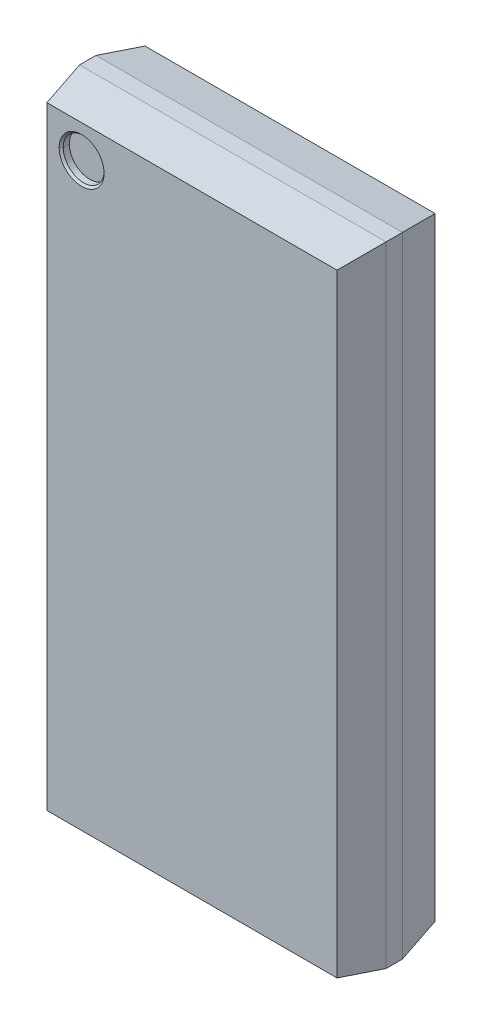
ISO-10303-21;
HEADER;
FILE_DESCRIPTION(('STEP AP214'),'2;1');
FILE_NAME('part.step','',(''),(''),'','','');
FILE_SCHEMA(('AUTOMOTIVE_DESIGN { 1 0 10303 214 1 1 1 1 }'));
ENDSEC;
DATA;
#1=APPLICATION_CONTEXT('core data for automotive mechanical design processes');
#2=APPLICATION_PROTOCOL_DEFINITION('international standard','automotive_design',2000,#1);
#3=PRODUCT_CONTEXT('',#1,'mechanical');
#4=PRODUCT('Part','Part','',(#3));
#5=PRODUCT_RELATED_PRODUCT_CATEGORY('part','',(#4));
#6=PRODUCT_DEFINITION_FORMATION('','',#4);
#7=PRODUCT_DEFINITION_CONTEXT('part definition',#1,'design');
#8=PRODUCT_DEFINITION('design','',#6,#7);
#9=PRODUCT_DEFINITION_SHAPE('','',#8);
#10=(LENGTH_UNIT() NAMED_UNIT(*) SI_UNIT(.MILLI.,.METRE.));
#11=(NAMED_UNIT(*) PLANE_ANGLE_UNIT() SI_UNIT($,.RADIAN.));
#12=(NAMED_UNIT(*) SI_UNIT($,.STERADIAN.) SOLID_ANGLE_UNIT());
#13=UNCERTAINTY_MEASURE_WITH_UNIT(LENGTH_MEASURE(1.E-05),#10,'distance_accuracy_value','');
#14=(GEOMETRIC_REPRESENTATION_CONTEXT(3) GLOBAL_UNCERTAINTY_ASSIGNED_CONTEXT((#13)) GLOBAL_UNIT_ASSIGNED_CONTEXT((#10,
#11,#12)) REPRESENTATION_CONTEXT('',''));
#15=CARTESIAN_POINT('',(0.,0.,0.));
#16=DIRECTION('',(0.,0.,1.));
#17=DIRECTION('',(1.,0.,0.));
#18=AXIS2_PLACEMENT_3D('',#15,#16,#17);
#19=CARTESIAN_POINT('',(-2.700000005961,6.564999993444,2.4));
#20=DIRECTION('',(0.,0.,1.));
#21=DIRECTION('',(1.,0.,0.));
#22=AXIS2_PLACEMENT_3D('',#19,#20,#21);
#23=PLANE('',#22);
#24=CARTESIAN_POINT('',(-2.700000005961,6.564999993444,2.4));
#25=DIRECTION('',(0.,0.,1.));
#26=DIRECTION('',(1.,0.,0.));
#27=AXIS2_PLACEMENT_3D('',#24,#25,#26);
#28=CIRCLE('',#27,0.5);
#29=CARTESIAN_POINT('',(-2.20000000596,6.564999993444,2.4));
#30=VERTEX_POINT('',#29);
#31=CARTESIAN_POINT('',(-3.200000005961,6.564999993444,2.4));
#32=VERTEX_POINT('',#31);
#33=EDGE_CURVE('E11',#30,#32,#28,.T.);
#34=ORIENTED_EDGE('',*,*,#33,.T.);
#35=CARTESIAN_POINT('',(-2.700000005961,6.564999993444,2.4));
#36=DIRECTION('',(0.,0.,1.));
#37=DIRECTION('',(1.,0.,0.));
#38=AXIS2_PLACEMENT_3D('',#35,#36,#37);
#39=CIRCLE('',#38,0.5);
#40=EDGE_CURVE('E221',#32,#30,#39,.T.);
#41=ORIENTED_EDGE('',*,*,#40,.T.);
#42=EDGE_LOOP('',(#34,#41));
#43=FACE_BOUND('',#42,.T.);
#44=ADVANCED_FACE('F16',(#43),#23,.T.);
#45=CARTESIAN_POINT('',(-2.700000005961,6.564999993444,2.4));
#46=DIRECTION('',(0.,0.,1.));
#47=DIRECTION('',(1.,0.,0.));
#48=AXIS2_PLACEMENT_3D('',#45,#46,#47);
#49=CYLINDRICAL_SURFACE('',#48,0.5);
#50=DIRECTION('',(0.,0.,1.));
#51=VECTOR('',#50,1.);
#52=CARTESIAN_POINT('',(-3.200000005961,6.564999993444,2.4));
#53=LINE('',#52,#51);
#54=CARTESIAN_POINT('',(-3.200000005906,6.564999993444,2.550000095312));
#55=VERTEX_POINT('',#54);
#56=EDGE_CURVE('E232',#32,#55,#53,.T.);
#57=ORIENTED_EDGE('',*,*,#56,.F.);
#58=ORIENTED_EDGE('',*,*,#33,.F.);
#59=DIRECTION('',(0.,0.,1.));
#60=VECTOR('',#59,1.);
#61=CARTESIAN_POINT('',(-2.20000000596,6.564999993444,2.4));
#62=LINE('',#61,#60);
#63=CARTESIAN_POINT('',(-2.200000006015,6.564999993444,2.550000095312));
#64=VERTEX_POINT('',#63);
#65=EDGE_CURVE('E235',#30,#64,#62,.T.);
#66=ORIENTED_EDGE('',*,*,#65,.T.);
#67=CARTESIAN_POINT('',(-2.700000005961,6.564999993444,2.550000095312));
#68=DIRECTION('',(0.,0.,1.));
#69=DIRECTION('',(0.,-1.,0.));
#70=AXIS2_PLACEMENT_3D('',#67,#68,#69);
#71=CIRCLE('',#70,0.499999999945);
#72=EDGE_CURVE('E27',#64,#55,#71,.T.);
#73=ORIENTED_EDGE('',*,*,#72,.T.);
#74=EDGE_LOOP('',(#57,#58,#66,#73));
#75=FACE_BOUND('',#74,.T.);
#76=ADVANCED_FACE('F231',(#75),#49,.F.);
#77=CARTESIAN_POINT('',(-2.700000005961,6.564999993444,2.600000095356));
#78=DIRECTION('',(0.,0.,1.));
#79=DIRECTION('',(1.,0.,0.));
#80=AXIS2_PLACEMENT_3D('',#77,#78,#79);
#81=CONICAL_SURFACE('',#80,0.550000000047,0.785398163397);
#82=DIRECTION('',(-0.707106781186548,0.,0.707106781186548));
#83=VECTOR('',#82,1.);
#84=CARTESIAN_POINT('',(-3.250000006007,6.564999993444,2.600000095356));
#85=LINE('',#84,#83);
#86=CARTESIAN_POINT('',(-3.250000006007,6.564999993444,2.600000095356));
#87=VERTEX_POINT('',#86);
#88=EDGE_CURVE('E213',#55,#87,#85,.T.);
#89=ORIENTED_EDGE('',*,*,#88,.F.);
#90=ORIENTED_EDGE('',*,*,#72,.F.);
#91=DIRECTION('',(0.707106781186548,0.,0.707106781186548));
#92=VECTOR('',#91,1.);
#93=CARTESIAN_POINT('',(-2.150000005914,6.564999993444,2.600000095356));
#94=LINE('',#93,#92);
#95=CARTESIAN_POINT('',(-2.150000005914,6.564999993444,2.600000095356));
#96=VERTEX_POINT('',#95);
#97=EDGE_CURVE('E217',#64,#96,#94,.T.);
#98=ORIENTED_EDGE('',*,*,#97,.T.);
#99=CARTESIAN_POINT('',(-2.700000005961,6.564999993444,2.600000095356));
#100=DIRECTION('',(0.,0.,-1.));
#101=DIRECTION('',(1.,0.,0.));
#102=AXIS2_PLACEMENT_3D('',#99,#100,#101);
#103=CIRCLE('',#102,0.550000000047);
#104=EDGE_CURVE('E126',#87,#96,#103,.T.);
#105=ORIENTED_EDGE('',*,*,#104,.F.);
#106=EDGE_LOOP('',(#89,#90,#98,#105));
#107=FACE_BOUND('',#106,.T.);
#108=ADVANCED_FACE('F246',(#107),#81,.F.);
#109=CARTESIAN_POINT('',(-3.750000005961,7.564999993444,2.600000095367));
#110=DIRECTION('',(0.,0.,1.));
#111=DIRECTION('',(1.,0.,0.));
#112=AXIS2_PLACEMENT_3D('',#109,#110,#111);
#113=PLANE('',#112);
#114=DIRECTION('',(0.,-1.,0.));
#115=VECTOR('',#114,1.);
#116=CARTESIAN_POINT('',(-3.550000005961,7.564999993444,2.600000095367));
#117=LINE('',#116,#115);
#118=CARTESIAN_POINT('',(-3.550000005961,7.364999993444,2.600000095367));
#119=VERTEX_POINT('',#118);
#120=CARTESIAN_POINT('',(-3.550000005961,-7.634999625087,2.600000095367));
#121=VERTEX_POINT('',#120);
#122=EDGE_CURVE('E130',#119,#121,#117,.T.);
#123=ORIENTED_EDGE('',*,*,#122,.T.);
#124=DIRECTION('',(-1.,0.,0.));
#125=VECTOR('',#124,1.);
#126=CARTESIAN_POINT('',(-3.550000005961,-7.634999625087,2.600000095367));
#127=LINE('',#126,#125);
#128=CARTESIAN_POINT('',(3.54999999404,-7.634999625087,2.600000095367));
#129=VERTEX_POINT('',#128);
#130=EDGE_CURVE('E41',#129,#121,#127,.T.);
#131=ORIENTED_EDGE('',*,*,#130,.F.);
#132=DIRECTION('',(0.,-1.,0.));
#133=VECTOR('',#132,1.);
#134=CARTESIAN_POINT('',(3.54999999404,7.564999993444,2.600000095367));
#135=LINE('',#134,#133);
#136=CARTESIAN_POINT('',(3.54999999404,7.364999993444,2.600000095367));
#137=VERTEX_POINT('',#136);
#138=EDGE_CURVE('E127',#137,#129,#135,.T.);
#139=ORIENTED_EDGE('',*,*,#138,.F.);
#140=DIRECTION('',(-1.,0.,0.));
#141=VECTOR('',#140,1.);
#142=CARTESIAN_POINT('',(-3.550000005961,7.364999993444,2.600000095367));
#143=LINE('',#142,#141);
#144=EDGE_CURVE('E134',#137,#119,#143,.T.);
#145=ORIENTED_EDGE('',*,*,#144,.T.);
#146=EDGE_LOOP('',(#123,#131,#139,#145));
#147=FACE_BOUND('',#146,.T.);
#148=CARTESIAN_POINT('',(-2.700000005961,6.564999993444,2.600000095356));
#149=DIRECTION('',(0.,0.,-1.));
#150=DIRECTION('',(1.,0.,0.));
#151=AXIS2_PLACEMENT_3D('',#148,#149,#150);
#152=CIRCLE('',#151,0.550000000047);
#153=EDGE_CURVE('E222',#96,#87,#152,.T.);
#154=ORIENTED_EDGE('',*,*,#153,.T.);
#155=ORIENTED_EDGE('',*,*,#104,.T.);
#156=EDGE_LOOP('',(#154,#155));
#157=FACE_BOUND('',#156,.T.);
#158=ADVANCED_FACE('F131',(#147,#157),#113,.T.);
#159=CARTESIAN_POINT('',(-3.550000005961,-7.734999625086,2.100000095367));
#160=DIRECTION('',(0.,-0.980580675690959,0.196116135137992));
#161=DIRECTION('',(-1.,0.,0.));
#162=AXIS2_PLACEMENT_3D('',#159,#160,#161);
#163=PLANE('',#162);
#164=DIRECTION('',(-1.,0.,0.));
#165=VECTOR('',#164,1.);
#166=CARTESIAN_POINT('',(-3.750000005961,-7.834999625086,1.600000095367));
#167=LINE('',#166,#165);
#168=CARTESIAN_POINT('',(3.749999994039,-7.834999625086,1.600000095367));
#169=VERTEX_POINT('',#168);
#170=CARTESIAN_POINT('',(-3.75000000596,-7.834999625086,1.600000095367));
#171=VERTEX_POINT('',#170);
#172=EDGE_CURVE('E146',#169,#171,#167,.T.);
#173=ORIENTED_EDGE('',*,*,#172,.F.);
#174=DIRECTION('',(0.192450089730061,-0.192450089730061,-0.962250448649302));
#175=VECTOR('',#174,1.);
#176=CARTESIAN_POINT('',(3.54999999404,-7.634999625087,2.600000095367));
#177=LINE('',#176,#175);
#178=EDGE_CURVE('E124',#129,#169,#177,.T.);
#179=ORIENTED_EDGE('',*,*,#178,.F.);
#180=ORIENTED_EDGE('',*,*,#130,.T.);
#181=DIRECTION('',(-0.192450089730061,-0.192450089730061,-0.962250448649302));
#182=VECTOR('',#181,1.);
#183=CARTESIAN_POINT('',(-3.550000005961,-7.634999625087,2.600000095367));
#184=LINE('',#183,#182);
#185=EDGE_CURVE('E122',#121,#171,#184,.T.);
#186=ORIENTED_EDGE('',*,*,#185,.T.);
#187=EDGE_LOOP('',(#173,#179,#180,#186));
#188=FACE_BOUND('',#187,.T.);
#189=ADVANCED_FACE('F120',(#188),#163,.T.);
#190=CARTESIAN_POINT('',(3.64999999404,7.564999993444,2.100000095367));
#191=DIRECTION('',(0.980580675690959,0.,0.196116135137992));
#192=DIRECTION('',(0.,-1.,0.));
#193=AXIS2_PLACEMENT_3D('',#190,#191,#192);
#194=PLANE('',#193);
#195=ORIENTED_EDGE('',*,*,#178,.T.);
#196=DIRECTION('',(0.,-1.,0.));
#197=VECTOR('',#196,1.);
#198=CARTESIAN_POINT('',(3.74999999404,7.564999993444,1.600000095367));
#199=LINE('',#198,#197);
#200=CARTESIAN_POINT('',(3.749999994039,7.564999993443,1.600000095367));
#201=VERTEX_POINT('',#200);
#202=EDGE_CURVE('E152',#201,#169,#199,.T.);
#203=ORIENTED_EDGE('',*,*,#202,.F.);
#204=DIRECTION('',(-0.192450089730061,-0.192450089730061,0.962250448649302));
#205=VECTOR('',#204,1.);
#206=CARTESIAN_POINT('',(3.74999999404,7.564999993443,1.600000095367));
#207=LINE('',#206,#205);
#208=EDGE_CURVE('E179',#201,#137,#207,.T.);
#209=ORIENTED_EDGE('',*,*,#208,.T.);
#210=ORIENTED_EDGE('',*,*,#138,.T.);
#211=EDGE_LOOP('',(#195,#203,#209,#210));
#212=FACE_BOUND('',#211,.T.);
#213=ADVANCED_FACE('F18',(#212),#194,.T.);
#214=CARTESIAN_POINT('',(-3.550000005961,7.464999993443,2.100000095367));
#215=DIRECTION('',(0.,-0.980580675690959,-0.196116135137992));
#216=DIRECTION('',(0.,0.196116135137992,-0.980580675690959));
#217=AXIS2_PLACEMENT_3D('',#214,#215,#216);
#218=PLANE('',#217);
#219=DIRECTION('',(-1.,0.,0.));
#220=VECTOR('',#219,1.);
#221=CARTESIAN_POINT('',(-3.750000005961,7.564999993444,1.600000095367));
#222=LINE('',#221,#220);
#223=CARTESIAN_POINT('',(-3.75000000596,7.564999993443,1.600000095367));
#224=VERTEX_POINT('',#223);
#225=EDGE_CURVE('E202',#201,#224,#222,.T.);
#226=ORIENTED_EDGE('',*,*,#225,.T.);
#227=DIRECTION('',(0.192450089730061,-0.192450089730061,0.962250448649302));
#228=VECTOR('',#227,1.);
#229=CARTESIAN_POINT('',(-3.75000000596,7.564999993443,1.600000095367));
#230=LINE('',#229,#228);
#231=EDGE_CURVE('E138',#224,#119,#230,.T.);
#232=ORIENTED_EDGE('',*,*,#231,.T.);
#233=ORIENTED_EDGE('',*,*,#144,.F.);
#234=ORIENTED_EDGE('',*,*,#208,.F.);
#235=EDGE_LOOP('',(#226,#232,#233,#234));
#236=FACE_BOUND('',#235,.T.);
#237=ADVANCED_FACE('F422',(#236),#218,.F.);
#238=CARTESIAN_POINT('',(-3.650000005961,7.564999993444,2.100000095367));
#239=DIRECTION('',(0.980580675690959,0.,-0.196116135137992));
#240=DIRECTION('',(0.,-1.,0.));
#241=AXIS2_PLACEMENT_3D('',#238,#239,#240);
#242=PLANE('',#241);
#243=DIRECTION('',(0.,-1.,0.));
#244=VECTOR('',#243,1.);
#245=CARTESIAN_POINT('',(-3.750000005961,7.564999993444,1.600000095367));
#246=LINE('',#245,#244);
#247=EDGE_CURVE('E143',#224,#171,#246,.T.);
#248=ORIENTED_EDGE('',*,*,#247,.T.);
#249=ORIENTED_EDGE('',*,*,#185,.F.);
#250=ORIENTED_EDGE('',*,*,#122,.F.);
#251=ORIENTED_EDGE('',*,*,#231,.F.);
#252=EDGE_LOOP('',(#248,#249,#250,#251));
#253=FACE_BOUND('',#252,.T.);
#254=ADVANCED_FACE('F141',(#253),#242,.F.);
#255=CARTESIAN_POINT('',(-3.750000005961,-7.834999625086,0.2));
#256=DIRECTION('',(0.,-1.,0.));
#257=DIRECTION('',(0.,0.,-1.));
#258=AXIS2_PLACEMENT_3D('',#255,#256,#257);
#259=PLANE('',#258);
#260=DIRECTION('',(1.,0.,0.));
#261=VECTOR('',#260,1.);
#262=CARTESIAN_POINT('',(-3.550000005961,-7.834999625086,1.2));
#263=LINE('',#262,#261);
#264=CARTESIAN_POINT('',(-3.75000000596,-7.834999625086,1.2));
#265=VERTEX_POINT('',#264);
#266=CARTESIAN_POINT('',(3.749999994039,-7.834999625086,1.2));
#267=VERTEX_POINT('',#266);
#268=EDGE_CURVE('E216',#265,#267,#263,.T.);
#269=ORIENTED_EDGE('',*,*,#268,.T.);
#270=DIRECTION('',(0.,0.,-1.));
#271=VECTOR('',#270,1.);
#272=CARTESIAN_POINT('',(3.74999999404,-7.834999625086,0.2));
#273=LINE('',#272,#271);
#274=EDGE_CURVE('E199',#169,#267,#273,.T.);
#275=ORIENTED_EDGE('',*,*,#274,.F.);
#276=ORIENTED_EDGE('',*,*,#172,.T.);
#277=DIRECTION('',(0.,0.,-1.));
#278=VECTOR('',#277,1.);
#279=CARTESIAN_POINT('',(-3.75000000596,-7.834999625086,0.2));
#280=LINE('',#279,#278);
#281=EDGE_CURVE('E167',#171,#265,#280,.T.);
#282=ORIENTED_EDGE('',*,*,#281,.T.);
#283=EDGE_LOOP('',(#269,#275,#276,#282));
#284=FACE_BOUND('',#283,.T.);
#285=ADVANCED_FACE('F421',(#284),#259,.T.);
#286=CARTESIAN_POINT('',(3.74999999404,7.564999993444,0.2));
#287=DIRECTION('',(1.,0.,0.));
#288=DIRECTION('',(0.,1.,0.));
#289=AXIS2_PLACEMENT_3D('',#286,#287,#288);
#290=PLANE('',#289);
#291=ORIENTED_EDGE('',*,*,#274,.T.);
#292=DIRECTION('',(0.,1.,0.));
#293=VECTOR('',#292,1.);
#294=CARTESIAN_POINT('',(3.749999994039,7.564999993444,1.2));
#295=LINE('',#294,#293);
#296=CARTESIAN_POINT('',(3.749999994039,7.564999993443,1.2));
#297=VERTEX_POINT('',#296);
#298=EDGE_CURVE('E162',#267,#297,#295,.T.);
#299=ORIENTED_EDGE('',*,*,#298,.T.);
#300=DIRECTION('',(0.,0.,1.));
#301=VECTOR('',#300,1.);
#302=CARTESIAN_POINT('',(3.749999994039,7.564999993444,0.2));
#303=LINE('',#302,#301);
#304=EDGE_CURVE('E20',#297,#201,#303,.T.);
#305=ORIENTED_EDGE('',*,*,#304,.T.);
#306=ORIENTED_EDGE('',*,*,#202,.T.);
#307=EDGE_LOOP('',(#291,#299,#305,#306));
#308=FACE_BOUND('',#307,.T.);
#309=ADVANCED_FACE('F478',(#308),#290,.T.);
#310=CARTESIAN_POINT('',(-3.750000005961,7.564999993444,0.2));
#311=DIRECTION('',(0.,-1.,0.));
#312=DIRECTION('',(0.,0.,-1.));
#313=AXIS2_PLACEMENT_3D('',#310,#311,#312);
#314=PLANE('',#313);
#315=ORIENTED_EDGE('',*,*,#304,.F.);
#316=DIRECTION('',(1.,0.,0.));
#317=VECTOR('',#316,1.);
#318=CARTESIAN_POINT('',(-3.550000005961,7.564999993443,1.2));
#319=LINE('',#318,#317);
#320=CARTESIAN_POINT('',(-3.75000000596,7.564999993443,1.2));
#321=VERTEX_POINT('',#320);
#322=EDGE_CURVE('E183',#321,#297,#319,.T.);
#323=ORIENTED_EDGE('',*,*,#322,.F.);
#324=DIRECTION('',(0.,0.,1.));
#325=VECTOR('',#324,1.);
#326=CARTESIAN_POINT('',(-3.750000005961,7.564999993443,0.2));
#327=LINE('',#326,#325);
#328=EDGE_CURVE('E166',#321,#224,#327,.T.);
#329=ORIENTED_EDGE('',*,*,#328,.T.);
#330=ORIENTED_EDGE('',*,*,#225,.F.);
#331=EDGE_LOOP('',(#315,#323,#329,#330));
#332=FACE_BOUND('',#331,.T.);
#333=ADVANCED_FACE('F467',(#332),#314,.F.);
#334=CARTESIAN_POINT('',(-3.750000005961,7.564999993444,0.2));
#335=DIRECTION('',(1.,0.,0.));
#336=DIRECTION('',(0.,1.,0.));
#337=AXIS2_PLACEMENT_3D('',#334,#335,#336);
#338=PLANE('',#337);
#339=DIRECTION('',(0.,1.,0.));
#340=VECTOR('',#339,1.);
#341=CARTESIAN_POINT('',(-3.75000000596,7.564999993444,1.2));
#342=LINE('',#341,#340);
#343=EDGE_CURVE('E203',#265,#321,#342,.T.);
#344=ORIENTED_EDGE('',*,*,#343,.F.);
#345=ORIENTED_EDGE('',*,*,#281,.F.);
#346=ORIENTED_EDGE('',*,*,#247,.F.);
#347=ORIENTED_EDGE('',*,*,#328,.F.);
#348=EDGE_LOOP('',(#344,#345,#346,#347));
#349=FACE_BOUND('',#348,.T.);
#350=ADVANCED_FACE('F389',(#349),#338,.F.);
#351=CARTESIAN_POINT('',(-3.550000005961,-7.734999625086,0.7));
#352=DIRECTION('',(0.,0.980580675690959,0.196116135137992));
#353=DIRECTION('',(1.,0.,0.));
#354=AXIS2_PLACEMENT_3D('',#351,#352,#353);
#355=PLANE('',#354);
#356=DIRECTION('',(0.192450089730061,-0.192450089730061,0.962250448649302));
#357=VECTOR('',#356,1.);
#358=CARTESIAN_POINT('',(3.54999999404,-7.634999625087,0.2));
#359=LINE('',#358,#357);
#360=CARTESIAN_POINT('',(3.54999999404,-7.634999625087,0.2));
#361=VERTEX_POINT('',#360);
#362=EDGE_CURVE('E158',#361,#267,#359,.T.);
#363=ORIENTED_EDGE('',*,*,#362,.T.);
#364=ORIENTED_EDGE('',*,*,#268,.F.);
#365=DIRECTION('',(-0.192450089730061,-0.192450089730061,0.962250448649302));
#366=VECTOR('',#365,1.);
#367=CARTESIAN_POINT('',(-3.550000005961,-7.634999625087,0.2));
#368=LINE('',#367,#366);
#369=CARTESIAN_POINT('',(-3.550000005961,-7.634999625087,0.2));
#370=VERTEX_POINT('',#369);
#371=EDGE_CURVE('E156',#370,#265,#368,.T.);
#372=ORIENTED_EDGE('',*,*,#371,.F.);
#373=DIRECTION('',(1.,0.,0.));
#374=VECTOR('',#373,1.);
#375=CARTESIAN_POINT('',(-3.750000005961,-7.634999625087,0.2));
#376=LINE('',#375,#374);
#377=EDGE_CURVE('E172',#370,#361,#376,.T.);
#378=ORIENTED_EDGE('',*,*,#377,.T.);
#379=EDGE_LOOP('',(#363,#364,#372,#378));
#380=FACE_BOUND('',#379,.T.);
#381=ADVANCED_FACE('F383',(#380),#355,.F.);
#382=CARTESIAN_POINT('',(3.64999999404,7.564999993444,0.7));
#383=DIRECTION('',(-0.980580675690959,0.,0.196116135137992));
#384=DIRECTION('',(0.,1.,0.));
#385=AXIS2_PLACEMENT_3D('',#382,#383,#384);
#386=PLANE('',#385);
#387=ORIENTED_EDGE('',*,*,#362,.F.);
#388=DIRECTION('',(0.,1.,0.));
#389=VECTOR('',#388,1.);
#390=CARTESIAN_POINT('',(3.54999999404,7.564999993444,0.2));
#391=LINE('',#390,#389);
#392=CARTESIAN_POINT('',(3.54999999404,7.364999993444,0.2));
#393=VERTEX_POINT('',#392);
#394=EDGE_CURVE('E168',#361,#393,#391,.T.);
#395=ORIENTED_EDGE('',*,*,#394,.T.);
#396=DIRECTION('',(-0.192450089730061,-0.192450089730061,-0.962250448649302));
#397=VECTOR('',#396,1.);
#398=CARTESIAN_POINT('',(3.74999999404,7.564999993443,1.2));
#399=LINE('',#398,#397);
#400=EDGE_CURVE('E163',#297,#393,#399,.T.);
#401=ORIENTED_EDGE('',*,*,#400,.F.);
#402=ORIENTED_EDGE('',*,*,#298,.F.);
#403=EDGE_LOOP('',(#387,#395,#401,#402));
#404=FACE_BOUND('',#403,.T.);
#405=ADVANCED_FACE('F388',(#404),#386,.F.);
#406=CARTESIAN_POINT('',(-3.550000005961,7.464999993443,0.7));
#407=DIRECTION('',(0.,0.980580675690959,-0.196116135137992));
#408=DIRECTION('',(-1.,0.,0.));
#409=AXIS2_PLACEMENT_3D('',#406,#407,#408);
#410=PLANE('',#409);
#411=DIRECTION('',(0.192450089730061,-0.192450089730061,-0.962250448649302));
#412=VECTOR('',#411,1.);
#413=CARTESIAN_POINT('',(-3.75000000596,7.564999993443,1.2));
#414=LINE('',#413,#412);
#415=CARTESIAN_POINT('',(-3.550000005961,7.364999993444,0.2));
#416=VERTEX_POINT('',#415);
#417=EDGE_CURVE('E187',#321,#416,#414,.T.);
#418=ORIENTED_EDGE('',*,*,#417,.F.);
#419=ORIENTED_EDGE('',*,*,#322,.T.);
#420=ORIENTED_EDGE('',*,*,#400,.T.);
#421=DIRECTION('',(-1.,0.,0.));
#422=VECTOR('',#421,1.);
#423=CARTESIAN_POINT('',(-3.750000005961,7.364999993444,0.2));
#424=LINE('',#423,#422);
#425=EDGE_CURVE('E173',#393,#416,#424,.T.);
#426=ORIENTED_EDGE('',*,*,#425,.T.);
#427=EDGE_LOOP('',(#418,#419,#420,#426));
#428=FACE_BOUND('',#427,.T.);
#429=ADVANCED_FACE('F453',(#428),#410,.T.);
#430=CARTESIAN_POINT('',(-3.650000005961,7.564999993444,0.7));
#431=DIRECTION('',(-0.980580675690959,0.,-0.196116135137992));
#432=DIRECTION('',(-0.196116135137992,0.,0.980580675690959));
#433=AXIS2_PLACEMENT_3D('',#430,#431,#432);
#434=PLANE('',#433);
#435=ORIENTED_EDGE('',*,*,#371,.T.);
#436=ORIENTED_EDGE('',*,*,#343,.T.);
#437=ORIENTED_EDGE('',*,*,#417,.T.);
#438=DIRECTION('',(0.,-1.,0.));
#439=VECTOR('',#438,1.);
#440=CARTESIAN_POINT('',(-3.550000005961,7.564999993444,0.2));
#441=LINE('',#440,#439);
#442=EDGE_CURVE('E174',#416,#370,#441,.T.);
#443=ORIENTED_EDGE('',*,*,#442,.T.);
#444=EDGE_LOOP('',(#435,#436,#437,#443));
#445=FACE_BOUND('',#444,.T.);
#446=ADVANCED_FACE('F445',(#445),#434,.T.);
#447=CARTESIAN_POINT('',(-3.750000005961,7.564999993444,0.2));
#448=DIRECTION('',(0.,0.,1.));
#449=DIRECTION('',(1.,0.,0.));
#450=AXIS2_PLACEMENT_3D('',#447,#448,#449);
#451=PLANE('',#450);
#452=ORIENTED_EDGE('',*,*,#425,.F.);
#453=ORIENTED_EDGE('',*,*,#394,.F.);
#454=ORIENTED_EDGE('',*,*,#377,.F.);
#455=ORIENTED_EDGE('',*,*,#442,.F.);
#456=EDGE_LOOP('',(#452,#453,#454,#455));
#457=FACE_BOUND('',#456,.T.);
#458=ADVANCED_FACE('F434',(#457),#451,.F.);
#459=CARTESIAN_POINT('',(-2.700000005961,6.564999993444,2.4));
#460=DIRECTION('',(0.,0.,1.));
#461=DIRECTION('',(1.,0.,0.));
#462=AXIS2_PLACEMENT_3D('',#459,#460,#461);
#463=CYLINDRICAL_SURFACE('',#462,0.5);
#464=ORIENTED_EDGE('',*,*,#40,.F.);
#465=ORIENTED_EDGE('',*,*,#56,.T.);
#466=CARTESIAN_POINT('',(-2.700000005961,6.564999993444,2.550000095312));
#467=DIRECTION('',(0.,0.,1.));
#468=DIRECTION('',(0.,-1.,0.));
#469=AXIS2_PLACEMENT_3D('',#466,#467,#468);
#470=CIRCLE('',#469,0.499999999945);
#471=EDGE_CURVE('E209',#55,#64,#470,.T.);
#472=ORIENTED_EDGE('',*,*,#471,.T.);
#473=ORIENTED_EDGE('',*,*,#65,.F.);
#474=EDGE_LOOP('',(#464,#465,#472,#473));
#475=FACE_BOUND('',#474,.T.);
#476=ADVANCED_FACE('F240',(#475),#463,.F.);
#477=CARTESIAN_POINT('',(-2.700000005961,6.564999993444,2.600000095356));
#478=DIRECTION('',(0.,0.,1.));
#479=DIRECTION('',(1.,0.,0.));
#480=AXIS2_PLACEMENT_3D('',#477,#478,#479);
#481=CONICAL_SURFACE('',#480,0.550000000047,0.785398163397);
#482=ORIENTED_EDGE('',*,*,#471,.F.);
#483=ORIENTED_EDGE('',*,*,#88,.T.);
#484=ORIENTED_EDGE('',*,*,#153,.F.);
#485=ORIENTED_EDGE('',*,*,#97,.F.);
#486=EDGE_LOOP('',(#482,#483,#484,#485));
#487=FACE_BOUND('',#486,.T.);
#488=ADVANCED_FACE('F252',(#487),#481,.F.);
#489=CLOSED_SHELL('',(#44,#76,#108,#158,#189,#213,#237,#254,#285,#309,#333,#350,#381,#405,#429,
#446,#458,#476,#488));
#490=MANIFOLD_SOLID_BREP('B1',#489);
#491=ADVANCED_BREP_SHAPE_REPRESENTATION('',(#18,#490),#14);
#492=SHAPE_DEFINITION_REPRESENTATION(#9,#491);
ENDSEC;
END-ISO-10303-21;
